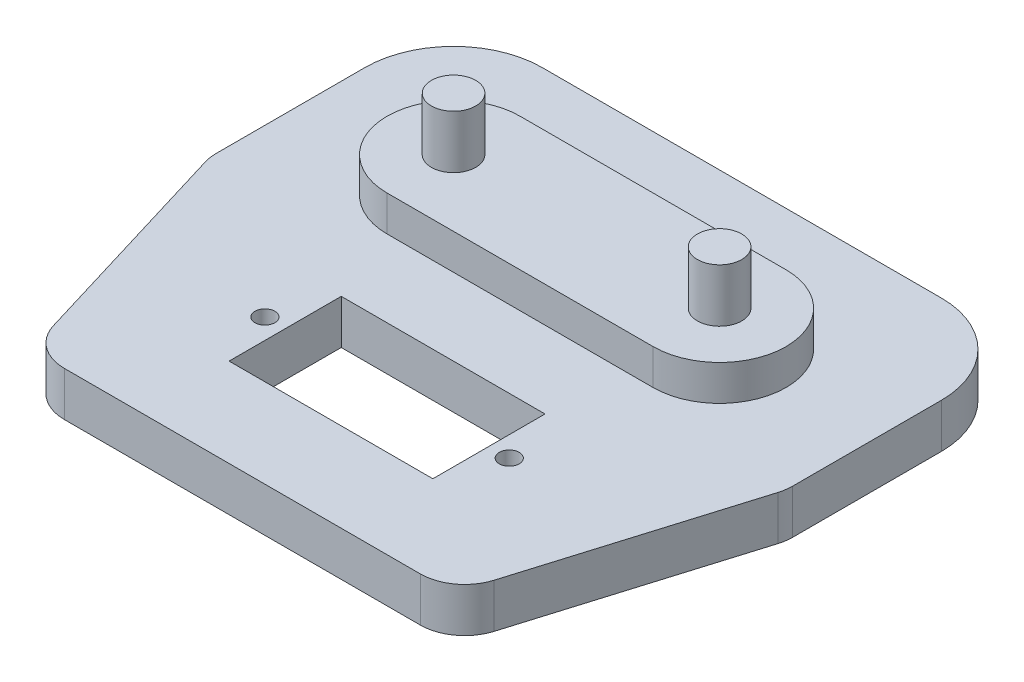
ISO-10303-21;
HEADER;
FILE_DESCRIPTION(('STEP AP214'),'2;1');
FILE_NAME('part.step','',(''),(''),'','','');
FILE_SCHEMA(('AUTOMOTIVE_DESIGN { 1 0 10303 214 1 1 1 1 }'));
ENDSEC;
DATA;
#1=APPLICATION_CONTEXT('core data for automotive mechanical design processes');
#2=APPLICATION_PROTOCOL_DEFINITION('international standard','automotive_design',2000,#1);
#3=PRODUCT_CONTEXT('',#1,'mechanical');
#4=PRODUCT('Part','Part','',(#3));
#5=PRODUCT_RELATED_PRODUCT_CATEGORY('part','',(#4));
#6=PRODUCT_DEFINITION_FORMATION('','',#4);
#7=PRODUCT_DEFINITION_CONTEXT('part definition',#1,'design');
#8=PRODUCT_DEFINITION('design','',#6,#7);
#9=PRODUCT_DEFINITION_SHAPE('','',#8);
#10=(LENGTH_UNIT() NAMED_UNIT(*) SI_UNIT(.MILLI.,.METRE.));
#11=(NAMED_UNIT(*) PLANE_ANGLE_UNIT() SI_UNIT($,.RADIAN.));
#12=(NAMED_UNIT(*) SI_UNIT($,.STERADIAN.) SOLID_ANGLE_UNIT());
#13=UNCERTAINTY_MEASURE_WITH_UNIT(LENGTH_MEASURE(1.E-05),#10,'distance_accuracy_value','');
#14=(GEOMETRIC_REPRESENTATION_CONTEXT(3) GLOBAL_UNCERTAINTY_ASSIGNED_CONTEXT((#13)) GLOBAL_UNIT_ASSIGNED_CONTEXT((#10,
#11,#12)) REPRESENTATION_CONTEXT('',''));
#15=CARTESIAN_POINT('',(0.,0.,0.));
#16=DIRECTION('',(0.,0.,1.));
#17=DIRECTION('',(1.,0.,0.));
#18=AXIS2_PLACEMENT_3D('',#15,#16,#17);
#19=CARTESIAN_POINT('',(11.49,5.,0.));
#20=DIRECTION('',(-1.,0.,0.));
#21=DIRECTION('',(0.,0.,1.));
#22=AXIS2_PLACEMENT_3D('',#19,#20,#21);
#23=PLANE('',#22);
#24=DIRECTION('',(0.,0.,-1.));
#25=VECTOR('',#24,1.);
#26=CARTESIAN_POINT('',(11.49,0.,0.));
#27=LINE('',#26,#25);
#28=CARTESIAN_POINT('',(11.49,0.,18.1625));
#29=VERTEX_POINT('',#28);
#30=CARTESIAN_POINT('',(11.49,0.,5.51250000000001));
#31=VERTEX_POINT('',#30);
#32=EDGE_CURVE('E265',#29,#31,#27,.T.);
#33=ORIENTED_EDGE('',*,*,#32,.F.);
#34=DIRECTION('',(0.,-1.,0.));
#35=VECTOR('',#34,1.);
#36=CARTESIAN_POINT('',(11.49,5.,18.1625));
#37=LINE('',#36,#35);
#38=CARTESIAN_POINT('',(11.49,5.,18.1625));
#39=VERTEX_POINT('',#38);
#40=EDGE_CURVE('E11',#39,#29,#37,.T.);
#41=ORIENTED_EDGE('',*,*,#40,.F.);
#42=DIRECTION('',(0.,0.,-1.));
#43=VECTOR('',#42,1.);
#44=CARTESIAN_POINT('',(11.49,5.,0.));
#45=LINE('',#44,#43);
#46=CARTESIAN_POINT('',(11.49,5.,5.51250000000001));
#47=VERTEX_POINT('',#46);
#48=EDGE_CURVE('E200',#39,#47,#45,.T.);
#49=ORIENTED_EDGE('',*,*,#48,.T.);
#50=DIRECTION('',(0.,-1.,0.));
#51=VECTOR('',#50,1.);
#52=CARTESIAN_POINT('',(11.49,5.,5.51250000000001));
#53=LINE('',#52,#51);
#54=EDGE_CURVE('E123',#47,#31,#53,.T.);
#55=ORIENTED_EDGE('',*,*,#54,.T.);
#56=EDGE_LOOP('',(#33,#41,#49,#55));
#57=FACE_BOUND('',#56,.T.);
#58=ADVANCED_FACE('F43',(#57),#23,.T.);
#59=CARTESIAN_POINT('',(0.,5.,18.1625));
#60=DIRECTION('',(0.,0.,-1.));
#61=DIRECTION('',(-1.,0.,0.));
#62=AXIS2_PLACEMENT_3D('',#59,#60,#61);
#63=PLANE('',#62);
#64=DIRECTION('',(1.,0.,0.));
#65=VECTOR('',#64,1.);
#66=CARTESIAN_POINT('',(0.,0.,18.1625));
#67=LINE('',#66,#65);
#68=CARTESIAN_POINT('',(-11.49,0.,18.1625));
#69=VERTEX_POINT('',#68);
#70=EDGE_CURVE('E187',#69,#29,#67,.T.);
#71=ORIENTED_EDGE('',*,*,#70,.F.);
#72=DIRECTION('',(0.,-1.,0.));
#73=VECTOR('',#72,1.);
#74=CARTESIAN_POINT('',(-11.49,5.,18.1625));
#75=LINE('',#74,#73);
#76=CARTESIAN_POINT('',(-11.49,5.,18.1625));
#77=VERTEX_POINT('',#76);
#78=EDGE_CURVE('E54',#77,#69,#75,.T.);
#79=ORIENTED_EDGE('',*,*,#78,.F.);
#80=DIRECTION('',(1.,0.,0.));
#81=VECTOR('',#80,1.);
#82=CARTESIAN_POINT('',(0.,5.,18.1625));
#83=LINE('',#82,#81);
#84=EDGE_CURVE('E185',#77,#39,#83,.T.);
#85=ORIENTED_EDGE('',*,*,#84,.T.);
#86=ORIENTED_EDGE('',*,*,#40,.T.);
#87=EDGE_LOOP('',(#71,#79,#85,#86));
#88=FACE_BOUND('',#87,.T.);
#89=ADVANCED_FACE('F183',(#88),#63,.T.);
#90=CARTESIAN_POINT('',(-11.49,5.,0.));
#91=DIRECTION('',(-1.,0.,0.));
#92=DIRECTION('',(0.,0.,1.));
#93=AXIS2_PLACEMENT_3D('',#90,#91,#92);
#94=PLANE('',#93);
#95=DIRECTION('',(0.,0.,-1.));
#96=VECTOR('',#95,1.);
#97=CARTESIAN_POINT('',(-11.49,0.,0.));
#98=LINE('',#97,#96);
#99=CARTESIAN_POINT('',(-11.49,0.,5.51250000000001));
#100=VERTEX_POINT('',#99);
#101=EDGE_CURVE('E270',#69,#100,#98,.T.);
#102=ORIENTED_EDGE('',*,*,#101,.T.);
#103=DIRECTION('',(0.,-1.,0.));
#104=VECTOR('',#103,1.);
#105=CARTESIAN_POINT('',(-11.49,5.,5.51250000000001));
#106=LINE('',#105,#104);
#107=CARTESIAN_POINT('',(-11.49,5.,5.51250000000001));
#108=VERTEX_POINT('',#107);
#109=EDGE_CURVE('E191',#108,#100,#106,.T.);
#110=ORIENTED_EDGE('',*,*,#109,.F.);
#111=DIRECTION('',(0.,0.,-1.));
#112=VECTOR('',#111,1.);
#113=CARTESIAN_POINT('',(-11.49,5.,0.));
#114=LINE('',#113,#112);
#115=EDGE_CURVE('E194',#77,#108,#114,.T.);
#116=ORIENTED_EDGE('',*,*,#115,.F.);
#117=ORIENTED_EDGE('',*,*,#78,.T.);
#118=EDGE_LOOP('',(#102,#110,#116,#117));
#119=FACE_BOUND('',#118,.T.);
#120=ADVANCED_FACE('F195',(#119),#94,.F.);
#121=CARTESIAN_POINT('',(32.5,5.,0.));
#122=DIRECTION('',(-1.,0.,0.));
#123=DIRECTION('',(0.,0.,1.));
#124=AXIS2_PLACEMENT_3D('',#121,#122,#123);
#125=PLANE('',#124);
#126=DIRECTION('',(0.,0.,-1.));
#127=VECTOR('',#126,1.);
#128=CARTESIAN_POINT('',(32.5,0.,0.));
#129=LINE('',#128,#127);
#130=CARTESIAN_POINT('',(32.5,0.,-1.40223411546572));
#131=VERTEX_POINT('',#130);
#132=CARTESIAN_POINT('',(32.5,0.,-18.1624999999999));
#133=VERTEX_POINT('',#132);
#134=EDGE_CURVE('E215',#131,#133,#129,.T.);
#135=ORIENTED_EDGE('',*,*,#134,.T.);
#136=DIRECTION('',(0.,-1.,0.));
#137=VECTOR('',#136,1.);
#138=CARTESIAN_POINT('',(32.5,5.,-18.1624999999999));
#139=LINE('',#138,#137);
#140=CARTESIAN_POINT('',(32.5,5.,-18.1624999999999));
#141=VERTEX_POINT('',#140);
#142=EDGE_CURVE('E47',#141,#133,#139,.T.);
#143=ORIENTED_EDGE('',*,*,#142,.F.);
#144=DIRECTION('',(0.,0.,-1.));
#145=VECTOR('',#144,1.);
#146=CARTESIAN_POINT('',(32.5,5.,0.));
#147=LINE('',#146,#145);
#148=CARTESIAN_POINT('',(32.5,5.,-1.40223411546572));
#149=VERTEX_POINT('',#148);
#150=EDGE_CURVE('E789',#149,#141,#147,.T.);
#151=ORIENTED_EDGE('',*,*,#150,.F.);
#152=DIRECTION('',(0.,-1.,0.));
#153=VECTOR('',#152,1.);
#154=CARTESIAN_POINT('',(32.5,5.,-1.40223411546572));
#155=LINE('',#154,#153);
#156=EDGE_CURVE('E214',#149,#131,#155,.T.);
#157=ORIENTED_EDGE('',*,*,#156,.T.);
#158=EDGE_LOOP('',(#135,#143,#151,#157));
#159=FACE_BOUND('',#158,.T.);
#160=ADVANCED_FACE('F45',(#159),#125,.F.);
#161=CARTESIAN_POINT('',(22.5,5.,-18.1625));
#162=DIRECTION('',(0.,-1.,0.));
#163=DIRECTION('',(0.,0.,-1.));
#164=AXIS2_PLACEMENT_3D('',#161,#162,#163);
#165=CYLINDRICAL_SURFACE('',#164,10.);
#166=CARTESIAN_POINT('',(22.5,0.,-18.1625));
#167=DIRECTION('',(0.,1.,0.));
#168=DIRECTION('',(0.,0.,1.));
#169=AXIS2_PLACEMENT_3D('',#166,#167,#168);
#170=CIRCLE('',#169,10.);
#171=CARTESIAN_POINT('',(22.4999999999999,0.,-28.1625));
#172=VERTEX_POINT('',#171);
#173=EDGE_CURVE('E219',#133,#172,#170,.T.);
#174=ORIENTED_EDGE('',*,*,#173,.T.);
#175=DIRECTION('',(0.,-1.,0.));
#176=VECTOR('',#175,1.);
#177=CARTESIAN_POINT('',(22.4999999999999,5.,-28.1625));
#178=LINE('',#177,#176);
#179=CARTESIAN_POINT('',(22.4999999999999,5.,-28.1625));
#180=VERTEX_POINT('',#179);
#181=EDGE_CURVE('E314',#180,#172,#178,.T.);
#182=ORIENTED_EDGE('',*,*,#181,.F.);
#183=CARTESIAN_POINT('',(22.5,5.,-18.1625));
#184=DIRECTION('',(0.,1.,0.));
#185=DIRECTION('',(0.,0.,1.));
#186=AXIS2_PLACEMENT_3D('',#183,#184,#185);
#187=CIRCLE('',#186,10.);
#188=EDGE_CURVE('E325',#141,#180,#187,.T.);
#189=ORIENTED_EDGE('',*,*,#188,.F.);
#190=ORIENTED_EDGE('',*,*,#142,.T.);
#191=EDGE_LOOP('',(#174,#182,#189,#190));
#192=FACE_BOUND('',#191,.T.);
#193=ADVANCED_FACE('F324',(#192),#165,.T.);
#194=CARTESIAN_POINT('',(0.,5.,-28.1625));
#195=DIRECTION('',(0.,0.,-1.));
#196=DIRECTION('',(-1.,0.,0.));
#197=AXIS2_PLACEMENT_3D('',#194,#195,#196);
#198=PLANE('',#197);
#199=DIRECTION('',(1.,0.,0.));
#200=VECTOR('',#199,1.);
#201=CARTESIAN_POINT('',(0.,0.,-28.1625));
#202=LINE('',#201,#200);
#203=CARTESIAN_POINT('',(-22.4999999999999,0.,-28.1625));
#204=VERTEX_POINT('',#203);
#205=EDGE_CURVE('E224',#204,#172,#202,.T.);
#206=ORIENTED_EDGE('',*,*,#205,.F.);
#207=DIRECTION('',(0.,-1.,0.));
#208=VECTOR('',#207,1.);
#209=CARTESIAN_POINT('',(-22.4999999999999,5.,-28.1625));
#210=LINE('',#209,#208);
#211=CARTESIAN_POINT('',(-22.4999999999999,5.,-28.1625));
#212=VERTEX_POINT('',#211);
#213=EDGE_CURVE('E312',#212,#204,#210,.T.);
#214=ORIENTED_EDGE('',*,*,#213,.F.);
#215=DIRECTION('',(1.,0.,0.));
#216=VECTOR('',#215,1.);
#217=CARTESIAN_POINT('',(0.,5.,-28.1625));
#218=LINE('',#217,#216);
#219=EDGE_CURVE('E339',#212,#180,#218,.T.);
#220=ORIENTED_EDGE('',*,*,#219,.T.);
#221=ORIENTED_EDGE('',*,*,#181,.T.);
#222=EDGE_LOOP('',(#206,#214,#220,#221));
#223=FACE_BOUND('',#222,.T.);
#224=ADVANCED_FACE('F337',(#223),#198,.T.);
#225=CARTESIAN_POINT('',(-22.5,5.,-18.1625));
#226=DIRECTION('',(0.,-1.,0.));
#227=DIRECTION('',(0.,0.,-1.));
#228=AXIS2_PLACEMENT_3D('',#225,#226,#227);
#229=CYLINDRICAL_SURFACE('',#228,10.);
#230=CARTESIAN_POINT('',(-22.5,0.,-18.1625));
#231=DIRECTION('',(0.,1.,0.));
#232=DIRECTION('',(0.,0.,1.));
#233=AXIS2_PLACEMENT_3D('',#230,#231,#232);
#234=CIRCLE('',#233,10.);
#235=CARTESIAN_POINT('',(-32.5,0.,-18.1624999999999));
#236=VERTEX_POINT('',#235);
#237=EDGE_CURVE('E228',#236,#204,#234,.F.);
#238=ORIENTED_EDGE('',*,*,#237,.F.);
#239=DIRECTION('',(0.,-1.,0.));
#240=VECTOR('',#239,1.);
#241=CARTESIAN_POINT('',(-32.5,5.,-18.1624999999999));
#242=LINE('',#241,#240);
#243=CARTESIAN_POINT('',(-32.5,5.,-18.1624999999999));
#244=VERTEX_POINT('',#243);
#245=EDGE_CURVE('E309',#244,#236,#242,.T.);
#246=ORIENTED_EDGE('',*,*,#245,.F.);
#247=CARTESIAN_POINT('',(-22.5,5.,-18.1625));
#248=DIRECTION('',(0.,1.,0.));
#249=DIRECTION('',(0.,0.,1.));
#250=AXIS2_PLACEMENT_3D('',#247,#248,#249);
#251=CIRCLE('',#250,10.);
#252=EDGE_CURVE('E346',#244,#212,#251,.F.);
#253=ORIENTED_EDGE('',*,*,#252,.T.);
#254=ORIENTED_EDGE('',*,*,#213,.T.);
#255=EDGE_LOOP('',(#238,#246,#253,#254));
#256=FACE_BOUND('',#255,.T.);
#257=ADVANCED_FACE('F350',(#256),#229,.T.);
#258=CARTESIAN_POINT('',(-32.5,5.,0.));
#259=DIRECTION('',(-1.,0.,0.));
#260=DIRECTION('',(0.,0.,1.));
#261=AXIS2_PLACEMENT_3D('',#258,#259,#260);
#262=PLANE('',#261);
#263=DIRECTION('',(0.,0.,-1.));
#264=VECTOR('',#263,1.);
#265=CARTESIAN_POINT('',(-32.5,0.,0.));
#266=LINE('',#265,#264);
#267=CARTESIAN_POINT('',(-32.5,0.,-1.40223411546571));
#268=VERTEX_POINT('',#267);
#269=EDGE_CURVE('E232',#268,#236,#266,.T.);
#270=ORIENTED_EDGE('',*,*,#269,.F.);
#271=DIRECTION('',(0.,-1.,0.));
#272=VECTOR('',#271,1.);
#273=CARTESIAN_POINT('',(-32.5,5.,-1.40223411546571));
#274=LINE('',#273,#272);
#275=CARTESIAN_POINT('',(-32.5,5.,-1.40223411546571));
#276=VERTEX_POINT('',#275);
#277=EDGE_CURVE('E306',#276,#268,#274,.T.);
#278=ORIENTED_EDGE('',*,*,#277,.F.);
#279=DIRECTION('',(0.,0.,-1.));
#280=VECTOR('',#279,1.);
#281=CARTESIAN_POINT('',(-32.5,5.,0.));
#282=LINE('',#281,#280);
#283=EDGE_CURVE('E352',#276,#244,#282,.T.);
#284=ORIENTED_EDGE('',*,*,#283,.T.);
#285=ORIENTED_EDGE('',*,*,#245,.T.);
#286=EDGE_LOOP('',(#270,#278,#284,#285));
#287=FACE_BOUND('',#286,.T.);
#288=ADVANCED_FACE('F437',(#287),#262,.T.);
#289=CARTESIAN_POINT('',(-27.5,5.,-1.40223411546569));
#290=DIRECTION('',(0.,-1.,0.));
#291=DIRECTION('',(0.,0.,-1.));
#292=AXIS2_PLACEMENT_3D('',#289,#290,#291);
#293=CYLINDRICAL_SURFACE('',#292,5.);
#294=CARTESIAN_POINT('',(-27.5,0.,-1.40223411546569));
#295=DIRECTION('',(0.,1.,0.));
#296=DIRECTION('',(0.,0.,1.));
#297=AXIS2_PLACEMENT_3D('',#294,#295,#296);
#298=CIRCLE('',#297,5.);
#299=CARTESIAN_POINT('',(-32.2858057160712,0.,0.045544751633762));
#300=VERTEX_POINT('',#299);
#301=EDGE_CURVE('E236',#300,#268,#298,.F.);
#302=ORIENTED_EDGE('',*,*,#301,.F.);
#303=DIRECTION('',(0.,-1.,0.));
#304=VECTOR('',#303,1.);
#305=CARTESIAN_POINT('',(-32.2858057160712,5.,0.045544751633762));
#306=LINE('',#305,#304);
#307=CARTESIAN_POINT('',(-32.2858057160712,5.,0.045544751633762));
#308=VERTEX_POINT('',#307);
#309=EDGE_CURVE('E303',#308,#300,#306,.T.);
#310=ORIENTED_EDGE('',*,*,#309,.F.);
#311=CARTESIAN_POINT('',(-27.5,5.,-1.40223411546569));
#312=DIRECTION('',(0.,1.,0.));
#313=DIRECTION('',(0.,0.,1.));
#314=AXIS2_PLACEMENT_3D('',#311,#312,#313);
#315=CIRCLE('',#314,5.);
#316=EDGE_CURVE('E355',#308,#276,#315,.F.);
#317=ORIENTED_EDGE('',*,*,#316,.T.);
#318=ORIENTED_EDGE('',*,*,#277,.T.);
#319=EDGE_LOOP('',(#302,#310,#317,#318));
#320=FACE_BOUND('',#319,.T.);
#321=ADVANCED_FACE('F433',(#320),#293,.T.);
#322=CARTESIAN_POINT('',(-29.5915043655634,5.,8.95187920443062));
#323=DIRECTION('',(0.95716114321425,0.,-0.289555773419887));
#324=DIRECTION('',(-0.289555773419887,0.,-0.95716114321425));
#325=AXIS2_PLACEMENT_3D('',#322,#323,#324);
#326=PLANE('',#325);
#327=DIRECTION('',(0.289555773419887,0.,0.95716114321425));
#328=VECTOR('',#327,1.);
#329=CARTESIAN_POINT('',(-29.5915043655634,0.,8.95187920443062));
#330=LINE('',#329,#328);
#331=CARTESIAN_POINT('',(-24.8546008075939,0.,24.6102788670994));
#332=VERTEX_POINT('',#331);
#333=EDGE_CURVE('E240',#300,#332,#330,.T.);
#334=ORIENTED_EDGE('',*,*,#333,.T.);
#335=DIRECTION('',(0.,-1.,0.));
#336=VECTOR('',#335,1.);
#337=CARTESIAN_POINT('',(-24.8546008075939,5.,24.6102788670994));
#338=LINE('',#337,#336);
#339=CARTESIAN_POINT('',(-24.8546008075939,5.,24.6102788670994));
#340=VERTEX_POINT('',#339);
#341=EDGE_CURVE('E299',#340,#332,#338,.T.);
#342=ORIENTED_EDGE('',*,*,#341,.F.);
#343=DIRECTION('',(0.289555773419887,0.,0.95716114321425));
#344=VECTOR('',#343,1.);
#345=CARTESIAN_POINT('',(-29.5915043655634,5.,8.95187920443062));
#346=LINE('',#345,#344);
#347=EDGE_CURVE('E362',#308,#340,#346,.T.);
#348=ORIENTED_EDGE('',*,*,#347,.F.);
#349=ORIENTED_EDGE('',*,*,#309,.T.);
#350=EDGE_LOOP('',(#334,#342,#348,#349));
#351=FACE_BOUND('',#350,.T.);
#352=ADVANCED_FACE('F429',(#351),#326,.F.);
#353=CARTESIAN_POINT('',(-20.0687950915226,5.,23.1625));
#354=DIRECTION('',(0.,-1.,0.));
#355=DIRECTION('',(0.,0.,-1.));
#356=AXIS2_PLACEMENT_3D('',#353,#354,#355);
#357=CYLINDRICAL_SURFACE('',#356,5.);
#358=CARTESIAN_POINT('',(-20.0687950915226,0.,23.1625));
#359=DIRECTION('',(0.,1.,0.));
#360=DIRECTION('',(0.,0.,1.));
#361=AXIS2_PLACEMENT_3D('',#358,#359,#360);
#362=CIRCLE('',#361,5.);
#363=CARTESIAN_POINT('',(-20.0687950915226,0.,28.1625));
#364=VERTEX_POINT('',#363);
#365=EDGE_CURVE('E243',#332,#364,#362,.T.);
#366=ORIENTED_EDGE('',*,*,#365,.T.);
#367=DIRECTION('',(0.,-1.,0.));
#368=VECTOR('',#367,1.);
#369=CARTESIAN_POINT('',(-20.0687950915226,5.,28.1625));
#370=LINE('',#369,#368);
#371=CARTESIAN_POINT('',(-20.0687950915226,5.,28.1625));
#372=VERTEX_POINT('',#371);
#373=EDGE_CURVE('E295',#372,#364,#370,.T.);
#374=ORIENTED_EDGE('',*,*,#373,.F.);
#375=CARTESIAN_POINT('',(-20.0687950915226,5.,23.1625));
#376=DIRECTION('',(0.,1.,0.));
#377=DIRECTION('',(0.,0.,1.));
#378=AXIS2_PLACEMENT_3D('',#375,#376,#377);
#379=CIRCLE('',#378,5.);
#380=EDGE_CURVE('E365',#340,#372,#379,.T.);
#381=ORIENTED_EDGE('',*,*,#380,.F.);
#382=ORIENTED_EDGE('',*,*,#341,.T.);
#383=EDGE_LOOP('',(#366,#374,#381,#382));
#384=FACE_BOUND('',#383,.T.);
#385=ADVANCED_FACE('F425',(#384),#357,.T.);
#386=CARTESIAN_POINT('',(0.,5.,28.1625));
#387=DIRECTION('',(0.,0.,-1.));
#388=DIRECTION('',(-1.,0.,0.));
#389=AXIS2_PLACEMENT_3D('',#386,#387,#388);
#390=PLANE('',#389);
#391=DIRECTION('',(1.,0.,0.));
#392=VECTOR('',#391,1.);
#393=CARTESIAN_POINT('',(0.,0.,28.1625));
#394=LINE('',#393,#392);
#395=CARTESIAN_POINT('',(20.0687950915226,0.,28.1625));
#396=VERTEX_POINT('',#395);
#397=EDGE_CURVE('E246',#364,#396,#394,.T.);
#398=ORIENTED_EDGE('',*,*,#397,.T.);
#399=DIRECTION('',(0.,-1.,0.));
#400=VECTOR('',#399,1.);
#401=CARTESIAN_POINT('',(20.0687950915226,5.,28.1625));
#402=LINE('',#401,#400);
#403=CARTESIAN_POINT('',(20.0687950915226,5.,28.1625));
#404=VERTEX_POINT('',#403);
#405=EDGE_CURVE('E292',#404,#396,#402,.T.);
#406=ORIENTED_EDGE('',*,*,#405,.F.);
#407=DIRECTION('',(1.,0.,0.));
#408=VECTOR('',#407,1.);
#409=CARTESIAN_POINT('',(0.,5.,28.1625));
#410=LINE('',#409,#408);
#411=EDGE_CURVE('E368',#372,#404,#410,.T.);
#412=ORIENTED_EDGE('',*,*,#411,.F.);
#413=ORIENTED_EDGE('',*,*,#373,.T.);
#414=EDGE_LOOP('',(#398,#406,#412,#413));
#415=FACE_BOUND('',#414,.T.);
#416=ADVANCED_FACE('F421',(#415),#390,.F.);
#417=CARTESIAN_POINT('',(20.0687950915226,5.,23.1625));
#418=DIRECTION('',(0.,-1.,0.));
#419=DIRECTION('',(0.,0.,-1.));
#420=AXIS2_PLACEMENT_3D('',#417,#418,#419);
#421=CYLINDRICAL_SURFACE('',#420,5.);
#422=CARTESIAN_POINT('',(20.0687950915226,0.,23.1625));
#423=DIRECTION('',(0.,1.,0.));
#424=DIRECTION('',(0.,0.,1.));
#425=AXIS2_PLACEMENT_3D('',#422,#423,#424);
#426=CIRCLE('',#425,5.);
#427=CARTESIAN_POINT('',(24.8546008075939,0.,24.6102788670994));
#428=VERTEX_POINT('',#427);
#429=EDGE_CURVE('E250',#428,#396,#426,.F.);
#430=ORIENTED_EDGE('',*,*,#429,.F.);
#431=DIRECTION('',(0.,-1.,0.));
#432=VECTOR('',#431,1.);
#433=CARTESIAN_POINT('',(24.8546008075939,5.,24.6102788670994));
#434=LINE('',#433,#432);
#435=CARTESIAN_POINT('',(24.8546008075939,5.,24.6102788670994));
#436=VERTEX_POINT('',#435);
#437=EDGE_CURVE('E289',#436,#428,#434,.T.);
#438=ORIENTED_EDGE('',*,*,#437,.F.);
#439=CARTESIAN_POINT('',(20.0687950915226,5.,23.1625));
#440=DIRECTION('',(0.,1.,0.));
#441=DIRECTION('',(0.,0.,1.));
#442=AXIS2_PLACEMENT_3D('',#439,#440,#441);
#443=CIRCLE('',#442,5.);
#444=EDGE_CURVE('E371',#436,#404,#443,.F.);
#445=ORIENTED_EDGE('',*,*,#444,.T.);
#446=ORIENTED_EDGE('',*,*,#405,.T.);
#447=EDGE_LOOP('',(#430,#438,#445,#446));
#448=FACE_BOUND('',#447,.T.);
#449=ADVANCED_FACE('F417',(#448),#421,.T.);
#450=CARTESIAN_POINT('',(29.5915043655634,5.,8.95187920443062));
#451=DIRECTION('',(0.95716114321425,0.,0.289555773419887));
#452=DIRECTION('',(0.289555773419887,0.,-0.95716114321425));
#453=AXIS2_PLACEMENT_3D('',#450,#451,#452);
#454=PLANE('',#453);
#455=DIRECTION('',(-0.289555773419887,0.,0.95716114321425));
#456=VECTOR('',#455,1.);
#457=CARTESIAN_POINT('',(29.5915043655634,0.,8.95187920443062));
#458=LINE('',#457,#456);
#459=CARTESIAN_POINT('',(32.2858057160713,0.,0.045544751633755));
#460=VERTEX_POINT('',#459);
#461=EDGE_CURVE('E254',#460,#428,#458,.T.);
#462=ORIENTED_EDGE('',*,*,#461,.F.);
#463=DIRECTION('',(0.,-1.,0.));
#464=VECTOR('',#463,1.);
#465=CARTESIAN_POINT('',(32.2858057160713,5.,0.045544751633755));
#466=LINE('',#465,#464);
#467=CARTESIAN_POINT('',(32.2858057160713,5.,0.045544751633755));
#468=VERTEX_POINT('',#467);
#469=EDGE_CURVE('E286',#468,#460,#466,.T.);
#470=ORIENTED_EDGE('',*,*,#469,.F.);
#471=DIRECTION('',(-0.289555773419887,0.,0.95716114321425));
#472=VECTOR('',#471,1.);
#473=CARTESIAN_POINT('',(29.5915043655634,5.,8.95187920443062));
#474=LINE('',#473,#472);
#475=EDGE_CURVE('E375',#468,#436,#474,.T.);
#476=ORIENTED_EDGE('',*,*,#475,.T.);
#477=ORIENTED_EDGE('',*,*,#437,.T.);
#478=EDGE_LOOP('',(#462,#470,#476,#477));
#479=FACE_BOUND('',#478,.T.);
#480=ADVANCED_FACE('F414',(#479),#454,.T.);
#481=CARTESIAN_POINT('',(0.,5.,5.51250000000001));
#482=DIRECTION('',(0.,0.,-1.));
#483=DIRECTION('',(-1.,0.,0.));
#484=AXIS2_PLACEMENT_3D('',#481,#482,#483);
#485=PLANE('',#484);
#486=DIRECTION('',(1.,0.,0.));
#487=VECTOR('',#486,1.);
#488=CARTESIAN_POINT('',(0.,0.,5.51250000000001));
#489=LINE('',#488,#487);
#490=EDGE_CURVE('E116',#100,#31,#489,.T.);
#491=ORIENTED_EDGE('',*,*,#490,.T.);
#492=ORIENTED_EDGE('',*,*,#54,.F.);
#493=DIRECTION('',(1.,0.,0.));
#494=VECTOR('',#493,1.);
#495=CARTESIAN_POINT('',(0.,5.,5.51250000000001));
#496=LINE('',#495,#494);
#497=EDGE_CURVE('E63',#108,#47,#496,.T.);
#498=ORIENTED_EDGE('',*,*,#497,.F.);
#499=ORIENTED_EDGE('',*,*,#109,.T.);
#500=EDGE_LOOP('',(#491,#492,#498,#499));
#501=FACE_BOUND('',#500,.T.);
#502=ADVANCED_FACE('F410',(#501),#485,.F.);
#503=CARTESIAN_POINT('',(-13.78,5.,11.8375));
#504=DIRECTION('',(0.,-1.,0.));
#505=DIRECTION('',(0.,0.,-1.));
#506=AXIS2_PLACEMENT_3D('',#503,#504,#505);
#507=CYLINDRICAL_SURFACE('',#506,1.125);
#508=CARTESIAN_POINT('',(-13.78,5.,11.8375));
#509=DIRECTION('',(0.,1.,0.));
#510=DIRECTION('',(0.,0.,1.));
#511=AXIS2_PLACEMENT_3D('',#508,#509,#510);
#512=CIRCLE('',#511,1.125);
#513=CARTESIAN_POINT('',(-13.78,5.,12.9625));
#514=VERTEX_POINT('',#513);
#515=EDGE_CURVE('E204',#514,#514,#512,.T.);
#516=ORIENTED_EDGE('',*,*,#515,.T.);
#517=EDGE_LOOP('',(#516));
#518=FACE_BOUND('',#517,.T.);
#519=CARTESIAN_POINT('',(-13.78,0.,11.8375));
#520=DIRECTION('',(0.,1.,0.));
#521=DIRECTION('',(0.,0.,1.));
#522=AXIS2_PLACEMENT_3D('',#519,#520,#521);
#523=CIRCLE('',#522,1.125);
#524=CARTESIAN_POINT('',(-13.78,0.,12.9625));
#525=VERTEX_POINT('',#524);
#526=EDGE_CURVE('E261',#525,#525,#523,.T.);
#527=ORIENTED_EDGE('',*,*,#526,.F.);
#528=EDGE_LOOP('',(#527));
#529=FACE_BOUND('',#528,.T.);
#530=ADVANCED_FACE('F385',(#518,#529),#507,.F.);
#531=CARTESIAN_POINT('',(27.5,5.,-1.4022341154657));
#532=DIRECTION('',(0.,-1.,0.));
#533=DIRECTION('',(0.,0.,-1.));
#534=AXIS2_PLACEMENT_3D('',#531,#532,#533);
#535=CYLINDRICAL_SURFACE('',#534,5.);
#536=CARTESIAN_POINT('',(27.5,0.,-1.4022341154657));
#537=DIRECTION('',(0.,1.,0.));
#538=DIRECTION('',(0.,0.,1.));
#539=AXIS2_PLACEMENT_3D('',#536,#537,#538);
#540=CIRCLE('',#539,5.);
#541=EDGE_CURVE('E258',#460,#131,#540,.T.);
#542=ORIENTED_EDGE('',*,*,#541,.T.);
#543=ORIENTED_EDGE('',*,*,#156,.F.);
#544=CARTESIAN_POINT('',(27.5,5.,-1.4022341154657));
#545=DIRECTION('',(0.,1.,0.));
#546=DIRECTION('',(0.,0.,1.));
#547=AXIS2_PLACEMENT_3D('',#544,#545,#546);
#548=CIRCLE('',#547,5.);
#549=EDGE_CURVE('E379',#468,#149,#548,.T.);
#550=ORIENTED_EDGE('',*,*,#549,.F.);
#551=ORIENTED_EDGE('',*,*,#469,.T.);
#552=EDGE_LOOP('',(#542,#543,#550,#551));
#553=FACE_BOUND('',#552,.T.);
#554=ADVANCED_FACE('F396',(#553),#535,.T.);
#555=CARTESIAN_POINT('',(13.78,5.,11.8375));
#556=DIRECTION('',(0.,-1.,0.));
#557=DIRECTION('',(0.,0.,-1.));
#558=AXIS2_PLACEMENT_3D('',#555,#556,#557);
#559=CYLINDRICAL_SURFACE('',#558,1.125);
#560=CARTESIAN_POINT('',(13.78,5.,11.8375));
#561=DIRECTION('',(0.,1.,0.));
#562=DIRECTION('',(0.,0.,1.));
#563=AXIS2_PLACEMENT_3D('',#560,#561,#562);
#564=CIRCLE('',#563,1.125);
#565=CARTESIAN_POINT('',(13.78,5.,12.9625));
#566=VERTEX_POINT('',#565);
#567=EDGE_CURVE('E210',#566,#566,#564,.F.);
#568=ORIENTED_EDGE('',*,*,#567,.F.);
#569=EDGE_LOOP('',(#568));
#570=FACE_BOUND('',#569,.T.);
#571=CARTESIAN_POINT('',(13.78,0.,11.8375));
#572=DIRECTION('',(0.,1.,0.));
#573=DIRECTION('',(0.,0.,1.));
#574=AXIS2_PLACEMENT_3D('',#571,#572,#573);
#575=CIRCLE('',#574,1.125);
#576=CARTESIAN_POINT('',(13.78,0.,12.9625));
#577=VERTEX_POINT('',#576);
#578=EDGE_CURVE('E275',#577,#577,#575,.F.);
#579=ORIENTED_EDGE('',*,*,#578,.T.);
#580=EDGE_LOOP('',(#579));
#581=FACE_BOUND('',#580,.T.);
#582=ADVANCED_FACE('F388',(#570,#581),#559,.F.);
#583=CARTESIAN_POINT('',(0.,5.,0.));
#584=DIRECTION('',(0.,1.,0.));
#585=DIRECTION('',(0.,0.,1.));
#586=AXIS2_PLACEMENT_3D('',#583,#584,#585);
#587=PLANE('',#586);
#588=DIRECTION('',(-1.,0.,0.));
#589=VECTOR('',#588,1.);
#590=CARTESIAN_POINT('',(0.,5.,-18.1625));
#591=LINE('',#590,#589);
#592=CARTESIAN_POINT('',(15.,5.,-18.1625));
#593=VERTEX_POINT('',#592);
#594=CARTESIAN_POINT('',(-15.,5.,-18.1625));
#595=VERTEX_POINT('',#594);
#596=EDGE_CURVE('E131',#593,#595,#591,.T.);
#597=ORIENTED_EDGE('',*,*,#596,.F.);
#598=CARTESIAN_POINT('',(15.,5.,-10.6625));
#599=DIRECTION('',(0.,1.,0.));
#600=DIRECTION('',(0.,0.,1.));
#601=AXIS2_PLACEMENT_3D('',#598,#599,#600);
#602=CIRCLE('',#601,7.5);
#603=CARTESIAN_POINT('',(15.,5.,-3.1625));
#604=VERTEX_POINT('',#603);
#605=EDGE_CURVE('E778',#593,#604,#602,.F.);
#606=ORIENTED_EDGE('',*,*,#605,.T.);
#607=DIRECTION('',(1.,0.,0.));
#608=VECTOR('',#607,1.);
#609=CARTESIAN_POINT('',(0.,5.,-3.16249999999999));
#610=LINE('',#609,#608);
#611=CARTESIAN_POINT('',(-15.,5.,-3.16249999999999));
#612=VERTEX_POINT('',#611);
#613=EDGE_CURVE('E781',#612,#604,#610,.T.);
#614=ORIENTED_EDGE('',*,*,#613,.F.);
#615=CARTESIAN_POINT('',(-15.,5.,-10.6625));
#616=DIRECTION('',(0.,1.,0.));
#617=DIRECTION('',(0.,0.,1.));
#618=AXIS2_PLACEMENT_3D('',#615,#616,#617);
#619=CIRCLE('',#618,7.5);
#620=EDGE_CURVE('E785',#595,#612,#619,.T.);
#621=ORIENTED_EDGE('',*,*,#620,.F.);
#622=EDGE_LOOP('',(#597,#606,#614,#621));
#623=FACE_BOUND('',#622,.T.);
#624=ORIENTED_EDGE('',*,*,#150,.T.);
#625=ORIENTED_EDGE('',*,*,#188,.T.);
#626=ORIENTED_EDGE('',*,*,#219,.F.);
#627=ORIENTED_EDGE('',*,*,#252,.F.);
#628=ORIENTED_EDGE('',*,*,#283,.F.);
#629=ORIENTED_EDGE('',*,*,#316,.F.);
#630=ORIENTED_EDGE('',*,*,#347,.T.);
#631=ORIENTED_EDGE('',*,*,#380,.T.);
#632=ORIENTED_EDGE('',*,*,#411,.T.);
#633=ORIENTED_EDGE('',*,*,#444,.F.);
#634=ORIENTED_EDGE('',*,*,#475,.F.);
#635=ORIENTED_EDGE('',*,*,#549,.T.);
#636=EDGE_LOOP('',(#624,#625,#626,#627,#628,#629,#630,#631,#632,#633,#634,#635));
#637=FACE_BOUND('',#636,.T.);
#638=ORIENTED_EDGE('',*,*,#515,.F.);
#639=EDGE_LOOP('',(#638));
#640=FACE_BOUND('',#639,.T.);
#641=ORIENTED_EDGE('',*,*,#48,.F.);
#642=ORIENTED_EDGE('',*,*,#84,.F.);
#643=ORIENTED_EDGE('',*,*,#115,.T.);
#644=ORIENTED_EDGE('',*,*,#497,.T.);
#645=EDGE_LOOP('',(#641,#642,#643,#644));
#646=FACE_BOUND('',#645,.T.);
#647=ORIENTED_EDGE('',*,*,#567,.T.);
#648=EDGE_LOOP('',(#647));
#649=FACE_BOUND('',#648,.T.);
#650=ADVANCED_FACE('F198',(#623,#637,#640,#646,#649),#587,.T.);
#651=CARTESIAN_POINT('',(0.,0.,0.));
#652=DIRECTION('',(0.,1.,0.));
#653=DIRECTION('',(0.,0.,1.));
#654=AXIS2_PLACEMENT_3D('',#651,#652,#653);
#655=PLANE('',#654);
#656=ORIENTED_EDGE('',*,*,#134,.F.);
#657=ORIENTED_EDGE('',*,*,#541,.F.);
#658=ORIENTED_EDGE('',*,*,#461,.T.);
#659=ORIENTED_EDGE('',*,*,#429,.T.);
#660=ORIENTED_EDGE('',*,*,#397,.F.);
#661=ORIENTED_EDGE('',*,*,#365,.F.);
#662=ORIENTED_EDGE('',*,*,#333,.F.);
#663=ORIENTED_EDGE('',*,*,#301,.T.);
#664=ORIENTED_EDGE('',*,*,#269,.T.);
#665=ORIENTED_EDGE('',*,*,#237,.T.);
#666=ORIENTED_EDGE('',*,*,#205,.T.);
#667=ORIENTED_EDGE('',*,*,#173,.F.);
#668=EDGE_LOOP('',(#656,#657,#658,#659,#660,#661,#662,#663,#664,#665,#666,#667));
#669=FACE_BOUND('',#668,.T.);
#670=ORIENTED_EDGE('',*,*,#526,.T.);
#671=EDGE_LOOP('',(#670));
#672=FACE_BOUND('',#671,.T.);
#673=ORIENTED_EDGE('',*,*,#32,.T.);
#674=ORIENTED_EDGE('',*,*,#490,.F.);
#675=ORIENTED_EDGE('',*,*,#101,.F.);
#676=ORIENTED_EDGE('',*,*,#70,.T.);
#677=EDGE_LOOP('',(#673,#674,#675,#676));
#678=FACE_BOUND('',#677,.T.);
#679=ORIENTED_EDGE('',*,*,#578,.F.);
#680=EDGE_LOOP('',(#679));
#681=FACE_BOUND('',#680,.T.);
#682=ADVANCED_FACE('F333',(#669,#672,#678,#681),#655,.F.);
#683=CARTESIAN_POINT('',(15.,9.,-10.6625));
#684=DIRECTION('',(0.,-1.,0.));
#685=DIRECTION('',(0.,0.,-1.));
#686=AXIS2_PLACEMENT_3D('',#683,#684,#685);
#687=CYLINDRICAL_SURFACE('',#686,7.5);
#688=DIRECTION('',(0.,-1.,0.));
#689=VECTOR('',#688,1.);
#690=CARTESIAN_POINT('',(15.,9.,-3.1625));
#691=LINE('',#690,#689);
#692=CARTESIAN_POINT('',(15.,9.,-3.1625));
#693=VERTEX_POINT('',#692);
#694=EDGE_CURVE('E761',#693,#604,#691,.T.);
#695=ORIENTED_EDGE('',*,*,#694,.T.);
#696=ORIENTED_EDGE('',*,*,#605,.F.);
#697=DIRECTION('',(0.,-1.,0.));
#698=VECTOR('',#697,1.);
#699=CARTESIAN_POINT('',(15.,9.,-18.1625));
#700=LINE('',#699,#698);
#701=CARTESIAN_POINT('',(15.,9.,-18.1625));
#702=VERTEX_POINT('',#701);
#703=EDGE_CURVE('E220',#702,#593,#700,.T.);
#704=ORIENTED_EDGE('',*,*,#703,.F.);
#705=CARTESIAN_POINT('',(15.,9.,-10.6625));
#706=DIRECTION('',(0.,1.,0.));
#707=DIRECTION('',(0.,0.,1.));
#708=AXIS2_PLACEMENT_3D('',#705,#706,#707);
#709=CIRCLE('',#708,7.5);
#710=EDGE_CURVE('E743',#702,#693,#709,.F.);
#711=ORIENTED_EDGE('',*,*,#710,.T.);
#712=EDGE_LOOP('',(#695,#696,#704,#711));
#713=FACE_BOUND('',#712,.T.);
#714=ADVANCED_FACE('F394',(#713),#687,.T.);
#715=CARTESIAN_POINT('',(0.,9.,-18.1625));
#716=DIRECTION('',(0.,0.,1.));
#717=DIRECTION('',(1.,0.,0.));
#718=AXIS2_PLACEMENT_3D('',#715,#716,#717);
#719=PLANE('',#718);
#720=ORIENTED_EDGE('',*,*,#596,.T.);
#721=DIRECTION('',(0.,-1.,0.));
#722=VECTOR('',#721,1.);
#723=CARTESIAN_POINT('',(-15.,9.,-18.1625));
#724=LINE('',#723,#722);
#725=CARTESIAN_POINT('',(-15.,9.,-18.1625));
#726=VERTEX_POINT('',#725);
#727=EDGE_CURVE('E769',#726,#595,#724,.T.);
#728=ORIENTED_EDGE('',*,*,#727,.F.);
#729=DIRECTION('',(-1.,0.,0.));
#730=VECTOR('',#729,1.);
#731=CARTESIAN_POINT('',(0.,9.,-18.1625));
#732=LINE('',#731,#730);
#733=EDGE_CURVE('E747',#702,#726,#732,.T.);
#734=ORIENTED_EDGE('',*,*,#733,.F.);
#735=ORIENTED_EDGE('',*,*,#703,.T.);
#736=EDGE_LOOP('',(#720,#728,#734,#735));
#737=FACE_BOUND('',#736,.T.);
#738=ADVANCED_FACE('F492',(#737),#719,.F.);
#739=CARTESIAN_POINT('',(-15.,9.,-10.6625));
#740=DIRECTION('',(0.,-1.,0.));
#741=DIRECTION('',(0.,0.,-1.));
#742=AXIS2_PLACEMENT_3D('',#739,#740,#741);
#743=CYLINDRICAL_SURFACE('',#742,7.5);
#744=ORIENTED_EDGE('',*,*,#620,.T.);
#745=DIRECTION('',(0.,-1.,0.));
#746=VECTOR('',#745,1.);
#747=CARTESIAN_POINT('',(-15.,9.,-3.16249999999999));
#748=LINE('',#747,#746);
#749=CARTESIAN_POINT('',(-15.,9.,-3.16249999999999));
#750=VERTEX_POINT('',#749);
#751=EDGE_CURVE('E765',#750,#612,#748,.T.);
#752=ORIENTED_EDGE('',*,*,#751,.F.);
#753=CARTESIAN_POINT('',(-15.,9.,-10.6625));
#754=DIRECTION('',(0.,1.,0.));
#755=DIRECTION('',(0.,0.,1.));
#756=AXIS2_PLACEMENT_3D('',#753,#754,#755);
#757=CIRCLE('',#756,7.5);
#758=EDGE_CURVE('E751',#726,#750,#757,.T.);
#759=ORIENTED_EDGE('',*,*,#758,.F.);
#760=ORIENTED_EDGE('',*,*,#727,.T.);
#761=EDGE_LOOP('',(#744,#752,#759,#760));
#762=FACE_BOUND('',#761,.T.);
#763=ADVANCED_FACE('F503',(#762),#743,.T.);
#764=CARTESIAN_POINT('',(0.,9.,-3.16249999999999));
#765=DIRECTION('',(0.,0.,-1.));
#766=DIRECTION('',(-1.,0.,0.));
#767=AXIS2_PLACEMENT_3D('',#764,#765,#766);
#768=PLANE('',#767);
#769=ORIENTED_EDGE('',*,*,#613,.T.);
#770=ORIENTED_EDGE('',*,*,#694,.F.);
#771=DIRECTION('',(1.,0.,0.));
#772=VECTOR('',#771,1.);
#773=CARTESIAN_POINT('',(0.,9.,-3.16249999999999));
#774=LINE('',#773,#772);
#775=EDGE_CURVE('E755',#750,#693,#774,.T.);
#776=ORIENTED_EDGE('',*,*,#775,.F.);
#777=ORIENTED_EDGE('',*,*,#751,.T.);
#778=EDGE_LOOP('',(#769,#770,#776,#777));
#779=FACE_BOUND('',#778,.T.);
#780=ADVANCED_FACE('F514',(#779),#768,.F.);
#781=CARTESIAN_POINT('',(0.,9.,0.));
#782=DIRECTION('',(0.,1.,0.));
#783=DIRECTION('',(0.,0.,1.));
#784=AXIS2_PLACEMENT_3D('',#781,#782,#783);
#785=PLANE('',#784);
#786=ORIENTED_EDGE('',*,*,#710,.F.);
#787=ORIENTED_EDGE('',*,*,#733,.T.);
#788=ORIENTED_EDGE('',*,*,#758,.T.);
#789=ORIENTED_EDGE('',*,*,#775,.T.);
#790=EDGE_LOOP('',(#786,#787,#788,#789));
#791=FACE_BOUND('',#790,.T.);
#792=CARTESIAN_POINT('',(-15.,9.,-10.6625));
#793=DIRECTION('',(0.,1.,0.));
#794=DIRECTION('',(0.,0.,1.));
#795=AXIS2_PLACEMENT_3D('',#792,#793,#794);
#796=CIRCLE('',#795,2.5);
#797=CARTESIAN_POINT('',(-15.,9.,-8.16249999999999));
#798=VERTEX_POINT('',#797);
#799=EDGE_CURVE('E728',#798,#798,#796,.T.);
#800=ORIENTED_EDGE('',*,*,#799,.F.);
#801=EDGE_LOOP('',(#800));
#802=FACE_BOUND('',#801,.T.);
#803=CARTESIAN_POINT('',(15.,9.,-10.6625));
#804=DIRECTION('',(0.,1.,0.));
#805=DIRECTION('',(0.,0.,1.));
#806=AXIS2_PLACEMENT_3D('',#803,#804,#805);
#807=CIRCLE('',#806,2.5);
#808=CARTESIAN_POINT('',(15.,9.,-8.1625));
#809=VERTEX_POINT('',#808);
#810=EDGE_CURVE('E737',#809,#809,#807,.T.);
#811=ORIENTED_EDGE('',*,*,#810,.F.);
#812=EDGE_LOOP('',(#811));
#813=FACE_BOUND('',#812,.T.);
#814=ADVANCED_FACE('F525',(#791,#802,#813),#785,.T.);
#815=CARTESIAN_POINT('',(0.,15.,0.));
#816=DIRECTION('',(0.,1.,0.));
#817=DIRECTION('',(0.,0.,1.));
#818=AXIS2_PLACEMENT_3D('',#815,#816,#817);
#819=PLANE('',#818);
#820=CARTESIAN_POINT('',(15.,15.,-10.6625));
#821=DIRECTION('',(0.,1.,0.));
#822=DIRECTION('',(0.,0.,1.));
#823=AXIS2_PLACEMENT_3D('',#820,#821,#822);
#824=CIRCLE('',#823,2.5);
#825=CARTESIAN_POINT('',(15.,15.,-8.1625));
#826=VERTEX_POINT('',#825);
#827=EDGE_CURVE('E733',#826,#826,#824,.F.);
#828=ORIENTED_EDGE('',*,*,#827,.F.);
#829=EDGE_LOOP('',(#828));
#830=FACE_BOUND('',#829,.T.);
#831=ADVANCED_FACE('F536',(#830),#819,.T.);
#832=CARTESIAN_POINT('',(15.,15.,-10.6625));
#833=DIRECTION('',(0.,-1.,0.));
#834=DIRECTION('',(0.,0.,-1.));
#835=AXIS2_PLACEMENT_3D('',#832,#833,#834);
#836=CYLINDRICAL_SURFACE('',#835,2.5);
#837=ORIENTED_EDGE('',*,*,#810,.T.);
#838=EDGE_LOOP('',(#837));
#839=FACE_BOUND('',#838,.T.);
#840=ORIENTED_EDGE('',*,*,#827,.T.);
#841=EDGE_LOOP('',(#840));
#842=FACE_BOUND('',#841,.T.);
#843=ADVANCED_FACE('F554',(#839,#842),#836,.T.);
#844=CARTESIAN_POINT('',(0.,15.,0.));
#845=DIRECTION('',(0.,1.,0.));
#846=DIRECTION('',(0.,0.,1.));
#847=AXIS2_PLACEMENT_3D('',#844,#845,#846);
#848=PLANE('',#847);
#849=CARTESIAN_POINT('',(-15.,15.,-10.6625));
#850=DIRECTION('',(0.,1.,0.));
#851=DIRECTION('',(0.,0.,1.));
#852=AXIS2_PLACEMENT_3D('',#849,#850,#851);
#853=CIRCLE('',#852,2.5);
#854=CARTESIAN_POINT('',(-15.,15.,-8.16249999999999));
#855=VERTEX_POINT('',#854);
#856=EDGE_CURVE('E731',#855,#855,#853,.T.);
#857=ORIENTED_EDGE('',*,*,#856,.T.);
#858=EDGE_LOOP('',(#857));
#859=FACE_BOUND('',#858,.T.);
#860=ADVANCED_FACE('F565',(#859),#848,.T.);
#861=CARTESIAN_POINT('',(-15.,15.,-10.6625));
#862=DIRECTION('',(0.,-1.,0.));
#863=DIRECTION('',(0.,0.,-1.));
#864=AXIS2_PLACEMENT_3D('',#861,#862,#863);
#865=CYLINDRICAL_SURFACE('',#864,2.5);
#866=ORIENTED_EDGE('',*,*,#799,.T.);
#867=EDGE_LOOP('',(#866));
#868=FACE_BOUND('',#867,.T.);
#869=ORIENTED_EDGE('',*,*,#856,.F.);
#870=EDGE_LOOP('',(#869));
#871=FACE_BOUND('',#870,.T.);
#872=ADVANCED_FACE('F576',(#868,#871),#865,.T.);
#873=CLOSED_SHELL('',(#58,#89,#120,#160,#193,#224,#257,#288,#321,#352,#385,#416,#449,#480,#502,
#530,#554,#582,#650,#682,#714,#738,#763,#780,#814,#831,#843,#860,#872));
#874=MANIFOLD_SOLID_BREP('B2',#873);
#875=ADVANCED_BREP_SHAPE_REPRESENTATION('',(#18,#874),#14);
#876=SHAPE_DEFINITION_REPRESENTATION(#9,#875);
ENDSEC;
END-ISO-10303-21;
